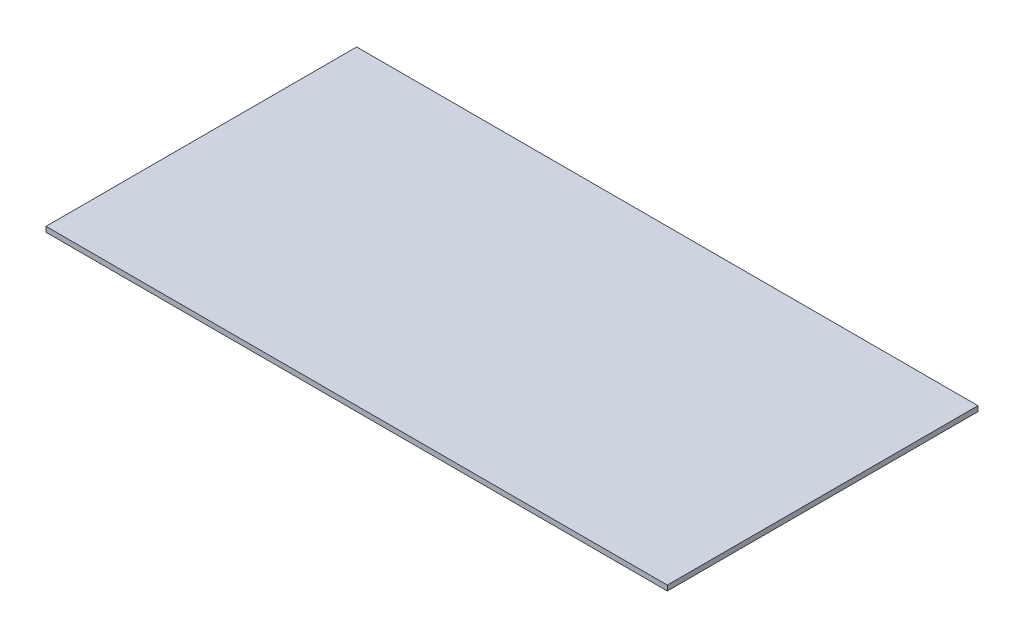
ISO-10303-21;
HEADER;
FILE_DESCRIPTION(('STEP AP214'),'2;1');
FILE_NAME('part.step','',(''),(''),'','','');
FILE_SCHEMA(('AUTOMOTIVE_DESIGN { 1 0 10303 214 1 1 1 1 }'));
ENDSEC;
DATA;
#1=APPLICATION_CONTEXT('core data for automotive mechanical design processes');
#2=APPLICATION_PROTOCOL_DEFINITION('international standard','automotive_design',2000,#1);
#3=PRODUCT_CONTEXT('',#1,'mechanical');
#4=PRODUCT('Part','Part','',(#3));
#5=PRODUCT_RELATED_PRODUCT_CATEGORY('part','',(#4));
#6=PRODUCT_DEFINITION_FORMATION('','',#4);
#7=PRODUCT_DEFINITION_CONTEXT('part definition',#1,'design');
#8=PRODUCT_DEFINITION('design','',#6,#7);
#9=PRODUCT_DEFINITION_SHAPE('','',#8);
#10=(LENGTH_UNIT() NAMED_UNIT(*) SI_UNIT(.MILLI.,.METRE.));
#11=(NAMED_UNIT(*) PLANE_ANGLE_UNIT() SI_UNIT($,.RADIAN.));
#12=(NAMED_UNIT(*) SI_UNIT($,.STERADIAN.) SOLID_ANGLE_UNIT());
#13=UNCERTAINTY_MEASURE_WITH_UNIT(LENGTH_MEASURE(1.E-05),#10,'distance_accuracy_value','');
#14=(GEOMETRIC_REPRESENTATION_CONTEXT(3) GLOBAL_UNCERTAINTY_ASSIGNED_CONTEXT((#13)) GLOBAL_UNIT_ASSIGNED_CONTEXT((#10,
#11,#12)) REPRESENTATION_CONTEXT('',''));
#15=CARTESIAN_POINT('',(0.,0.,0.));
#16=DIRECTION('',(0.,0.,1.));
#17=DIRECTION('',(1.,0.,0.));
#18=AXIS2_PLACEMENT_3D('',#15,#16,#17);
#19=CARTESIAN_POINT('',(152.4,2.54,76.2));
#20=DIRECTION('',(-1.,0.,0.));
#21=DIRECTION('',(0.,0.,1.));
#22=AXIS2_PLACEMENT_3D('',#19,#20,#21);
#23=PLANE('',#22);
#24=DIRECTION('',(0.,0.,-1.));
#25=VECTOR('',#24,1.);
#26=CARTESIAN_POINT('',(152.4,0.,76.2));
#27=LINE('',#26,#25);
#28=CARTESIAN_POINT('',(152.4,0.,76.2));
#29=VERTEX_POINT('',#28);
#30=CARTESIAN_POINT('',(152.4,0.,-76.2));
#31=VERTEX_POINT('',#30);
#32=EDGE_CURVE('E113',#29,#31,#27,.T.);
#33=ORIENTED_EDGE('',*,*,#32,.T.);
#34=DIRECTION('',(0.,-1.,0.));
#35=VECTOR('',#34,1.);
#36=CARTESIAN_POINT('',(152.4,2.54,-76.2));
#37=LINE('',#36,#35);
#38=CARTESIAN_POINT('',(152.4,2.54,-76.2));
#39=VERTEX_POINT('',#38);
#40=EDGE_CURVE('E11',#39,#31,#37,.T.);
#41=ORIENTED_EDGE('',*,*,#40,.F.);
#42=DIRECTION('',(0.,0.,-1.));
#43=VECTOR('',#42,1.);
#44=CARTESIAN_POINT('',(152.4,2.54,76.2));
#45=LINE('',#44,#43);
#46=CARTESIAN_POINT('',(152.4,2.54,76.2));
#47=VERTEX_POINT('',#46);
#48=EDGE_CURVE('E97',#47,#39,#45,.T.);
#49=ORIENTED_EDGE('',*,*,#48,.F.);
#50=DIRECTION('',(0.,-1.,0.));
#51=VECTOR('',#50,1.);
#52=CARTESIAN_POINT('',(152.4,2.54,76.2));
#53=LINE('',#52,#51);
#54=EDGE_CURVE('E109',#47,#29,#53,.T.);
#55=ORIENTED_EDGE('',*,*,#54,.T.);
#56=EDGE_LOOP('',(#33,#41,#49,#55));
#57=FACE_BOUND('',#56,.T.);
#58=ADVANCED_FACE('F45',(#57),#23,.F.);
#59=CARTESIAN_POINT('',(-152.4,2.54,-76.2));
#60=DIRECTION('',(0.,0.,1.));
#61=DIRECTION('',(1.,0.,0.));
#62=AXIS2_PLACEMENT_3D('',#59,#60,#61);
#63=PLANE('',#62);
#64=DIRECTION('',(-1.,0.,0.));
#65=VECTOR('',#64,1.);
#66=CARTESIAN_POINT('',(-152.4,0.,-76.2));
#67=LINE('',#66,#65);
#68=CARTESIAN_POINT('',(-152.4,0.,-76.2));
#69=VERTEX_POINT('',#68);
#70=EDGE_CURVE('E102',#31,#69,#67,.T.);
#71=ORIENTED_EDGE('',*,*,#70,.T.);
#72=DIRECTION('',(0.,-1.,0.));
#73=VECTOR('',#72,1.);
#74=CARTESIAN_POINT('',(-152.4,2.54,-76.2));
#75=LINE('',#74,#73);
#76=CARTESIAN_POINT('',(-152.4,2.54,-76.2));
#77=VERTEX_POINT('',#76);
#78=EDGE_CURVE('E54',#77,#69,#75,.T.);
#79=ORIENTED_EDGE('',*,*,#78,.F.);
#80=DIRECTION('',(-1.,0.,0.));
#81=VECTOR('',#80,1.);
#82=CARTESIAN_POINT('',(-152.4,2.54,-76.2));
#83=LINE('',#82,#81);
#84=EDGE_CURVE('E92',#39,#77,#83,.T.);
#85=ORIENTED_EDGE('',*,*,#84,.F.);
#86=ORIENTED_EDGE('',*,*,#40,.T.);
#87=EDGE_LOOP('',(#71,#79,#85,#86));
#88=FACE_BOUND('',#87,.T.);
#89=ADVANCED_FACE('F101',(#88),#63,.F.);
#90=CARTESIAN_POINT('',(-152.4,2.54,76.2));
#91=DIRECTION('',(1.,0.,0.));
#92=DIRECTION('',(0.,0.,-1.));
#93=AXIS2_PLACEMENT_3D('',#90,#91,#92);
#94=PLANE('',#93);
#95=DIRECTION('',(0.,0.,1.));
#96=VECTOR('',#95,1.);
#97=CARTESIAN_POINT('',(-152.4,0.,76.2));
#98=LINE('',#97,#96);
#99=CARTESIAN_POINT('',(-152.4,0.,76.2));
#100=VERTEX_POINT('',#99);
#101=EDGE_CURVE('E79',#69,#100,#98,.T.);
#102=ORIENTED_EDGE('',*,*,#101,.T.);
#103=DIRECTION('',(0.,-1.,0.));
#104=VECTOR('',#103,1.);
#105=CARTESIAN_POINT('',(-152.4,2.54,76.2));
#106=LINE('',#105,#104);
#107=CARTESIAN_POINT('',(-152.4,2.54,76.2));
#108=VERTEX_POINT('',#107);
#109=EDGE_CURVE('E104',#108,#100,#106,.T.);
#110=ORIENTED_EDGE('',*,*,#109,.F.);
#111=DIRECTION('',(0.,0.,1.));
#112=VECTOR('',#111,1.);
#113=CARTESIAN_POINT('',(-152.4,2.54,76.2));
#114=LINE('',#113,#112);
#115=EDGE_CURVE('E95',#77,#108,#114,.T.);
#116=ORIENTED_EDGE('',*,*,#115,.F.);
#117=ORIENTED_EDGE('',*,*,#78,.T.);
#118=EDGE_LOOP('',(#102,#110,#116,#117));
#119=FACE_BOUND('',#118,.T.);
#120=ADVANCED_FACE('F105',(#119),#94,.F.);
#121=CARTESIAN_POINT('',(-152.4,2.54,76.2));
#122=DIRECTION('',(0.,0.,-1.));
#123=DIRECTION('',(-1.,0.,0.));
#124=AXIS2_PLACEMENT_3D('',#121,#122,#123);
#125=PLANE('',#124);
#126=DIRECTION('',(1.,0.,0.));
#127=VECTOR('',#126,1.);
#128=CARTESIAN_POINT('',(-152.4,0.,76.2));
#129=LINE('',#128,#127);
#130=EDGE_CURVE('E85',#100,#29,#129,.T.);
#131=ORIENTED_EDGE('',*,*,#130,.T.);
#132=ORIENTED_EDGE('',*,*,#54,.F.);
#133=DIRECTION('',(1.,0.,0.));
#134=VECTOR('',#133,1.);
#135=CARTESIAN_POINT('',(-152.4,2.54,76.2));
#136=LINE('',#135,#134);
#137=EDGE_CURVE('E62',#108,#47,#136,.T.);
#138=ORIENTED_EDGE('',*,*,#137,.F.);
#139=ORIENTED_EDGE('',*,*,#109,.T.);
#140=EDGE_LOOP('',(#131,#132,#138,#139));
#141=FACE_BOUND('',#140,.T.);
#142=ADVANCED_FACE('F126',(#141),#125,.F.);
#143=CARTESIAN_POINT('',(0.,2.54,0.));
#144=DIRECTION('',(0.,-1.,0.));
#145=DIRECTION('',(0.,0.,-1.));
#146=AXIS2_PLACEMENT_3D('',#143,#144,#145);
#147=PLANE('',#146);
#148=ORIENTED_EDGE('',*,*,#48,.T.);
#149=ORIENTED_EDGE('',*,*,#84,.T.);
#150=ORIENTED_EDGE('',*,*,#115,.T.);
#151=ORIENTED_EDGE('',*,*,#137,.T.);
#152=EDGE_LOOP('',(#148,#149,#150,#151));
#153=FACE_BOUND('',#152,.T.);
#154=ADVANCED_FACE('F93',(#153),#147,.F.);
#155=CARTESIAN_POINT('',(0.,0.,0.));
#156=DIRECTION('',(0.,-1.,0.));
#157=DIRECTION('',(0.,0.,-1.));
#158=AXIS2_PLACEMENT_3D('',#155,#156,#157);
#159=PLANE('',#158);
#160=ORIENTED_EDGE('',*,*,#32,.F.);
#161=ORIENTED_EDGE('',*,*,#130,.F.);
#162=ORIENTED_EDGE('',*,*,#101,.F.);
#163=ORIENTED_EDGE('',*,*,#70,.F.);
#164=EDGE_LOOP('',(#160,#161,#162,#163));
#165=FACE_BOUND('',#164,.T.);
#166=ADVANCED_FACE('F129',(#165),#159,.T.);
#167=CLOSED_SHELL('',(#58,#89,#120,#142,#154,#166));
#168=MANIFOLD_SOLID_BREP('B2',#167);
#169=ADVANCED_BREP_SHAPE_REPRESENTATION('',(#18,#168),#14);
#170=SHAPE_DEFINITION_REPRESENTATION(#9,#169);
ENDSEC;
END-ISO-10303-21;
